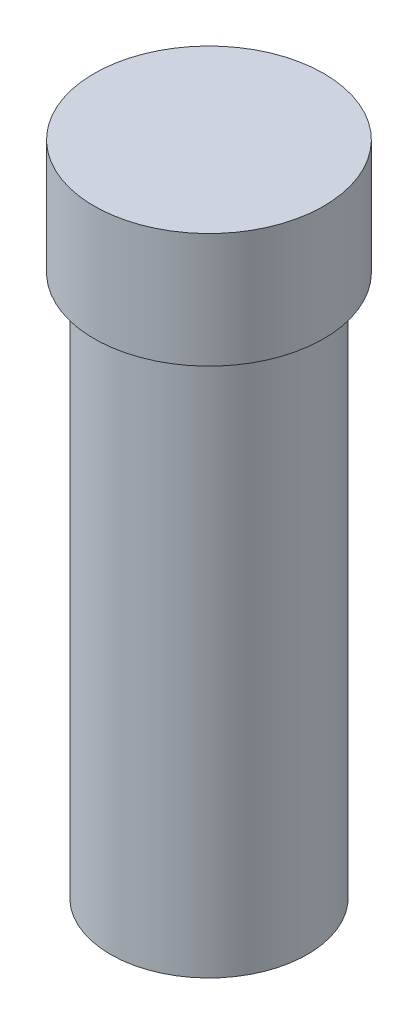
ISO-10303-21;
HEADER;
FILE_DESCRIPTION(('STEP AP214'),'2;1');
FILE_NAME('part.step','',(''),(''),'','','');
FILE_SCHEMA(('AUTOMOTIVE_DESIGN { 1 0 10303 214 1 1 1 1 }'));
ENDSEC;
DATA;
#1=APPLICATION_CONTEXT('core data for automotive mechanical design processes');
#2=APPLICATION_PROTOCOL_DEFINITION('international standard','automotive_design',2000,#1);
#3=PRODUCT_CONTEXT('',#1,'mechanical');
#4=PRODUCT('Part','Part','',(#3));
#5=PRODUCT_RELATED_PRODUCT_CATEGORY('part','',(#4));
#6=PRODUCT_DEFINITION_FORMATION('','',#4);
#7=PRODUCT_DEFINITION_CONTEXT('part definition',#1,'design');
#8=PRODUCT_DEFINITION('design','',#6,#7);
#9=PRODUCT_DEFINITION_SHAPE('','',#8);
#10=(LENGTH_UNIT() NAMED_UNIT(*) SI_UNIT(.MILLI.,.METRE.));
#11=(NAMED_UNIT(*) PLANE_ANGLE_UNIT() SI_UNIT($,.RADIAN.));
#12=(NAMED_UNIT(*) SI_UNIT($,.STERADIAN.) SOLID_ANGLE_UNIT());
#13=UNCERTAINTY_MEASURE_WITH_UNIT(LENGTH_MEASURE(1.E-05),#10,'distance_accuracy_value','');
#14=(GEOMETRIC_REPRESENTATION_CONTEXT(3) GLOBAL_UNCERTAINTY_ASSIGNED_CONTEXT((#13)) GLOBAL_UNIT_ASSIGNED_CONTEXT((#10,
#11,#12)) REPRESENTATION_CONTEXT('',''));
#15=CARTESIAN_POINT('',(0.,0.,0.));
#16=DIRECTION('',(0.,0.,1.));
#17=DIRECTION('',(1.,0.,0.));
#18=AXIS2_PLACEMENT_3D('',#15,#16,#17);
#19=CARTESIAN_POINT('',(6.,0.,0.));
#20=DIRECTION('',(0.,-1.,0.));
#21=DIRECTION('',(0.,0.,-1.));
#22=AXIS2_PLACEMENT_3D('',#19,#20,#21);
#23=PLANE('',#22);
#24=CARTESIAN_POINT('',(0.,0.,0.));
#25=DIRECTION('',(0.,-1.,0.));
#26=DIRECTION('',(0.,0.,-1.));
#27=AXIS2_PLACEMENT_3D('',#24,#25,#26);
#28=CIRCLE('',#27,6.);
#29=CARTESIAN_POINT('',(0.,0.,-6.));
#30=VERTEX_POINT('',#29);
#31=EDGE_CURVE('E60',#30,#30,#28,.T.);
#32=ORIENTED_EDGE('',*,*,#31,.T.);
#33=EDGE_LOOP('',(#32));
#34=FACE_BOUND('',#33,.T.);
#35=ADVANCED_FACE('F43',(#34),#23,.T.);
#36=CARTESIAN_POINT('',(0.,40.,0.));
#37=DIRECTION('',(0.,1.,0.));
#38=DIRECTION('',(0.,0.,1.));
#39=AXIS2_PLACEMENT_3D('',#36,#37,#38);
#40=PLANE('',#39);
#41=CARTESIAN_POINT('',(0.,40.,0.));
#42=DIRECTION('',(0.,-1.,0.));
#43=DIRECTION('',(0.,0.,-1.));
#44=AXIS2_PLACEMENT_3D('',#41,#42,#43);
#45=CIRCLE('',#44,6.99999999999999);
#46=CARTESIAN_POINT('',(0.,40.,-6.99999999999999));
#47=VERTEX_POINT('',#46);
#48=EDGE_CURVE('E10',#47,#47,#45,.T.);
#49=ORIENTED_EDGE('',*,*,#48,.F.);
#50=EDGE_LOOP('',(#49));
#51=FACE_BOUND('',#50,.T.);
#52=ADVANCED_FACE('F79',(#51),#40,.T.);
#53=CARTESIAN_POINT('',(0.,0.,0.));
#54=DIRECTION('',(0.,-1.,0.));
#55=DIRECTION('',(0.,0.,-1.));
#56=AXIS2_PLACEMENT_3D('',#53,#54,#55);
#57=CYLINDRICAL_SURFACE('',#56,7.);
#58=ORIENTED_EDGE('',*,*,#48,.T.);
#59=EDGE_LOOP('',(#58));
#60=FACE_BOUND('',#59,.T.);
#61=CARTESIAN_POINT('',(0.,33.,0.));
#62=DIRECTION('',(0.,-1.,0.));
#63=DIRECTION('',(0.,0.,-1.));
#64=AXIS2_PLACEMENT_3D('',#61,#62,#63);
#65=CIRCLE('',#64,7.);
#66=CARTESIAN_POINT('',(0.,33.,-7.));
#67=VERTEX_POINT('',#66);
#68=EDGE_CURVE('E50',#67,#67,#65,.T.);
#69=ORIENTED_EDGE('',*,*,#68,.F.);
#70=EDGE_LOOP('',(#69));
#71=FACE_BOUND('',#70,.T.);
#72=ADVANCED_FACE('F76',(#60,#71),#57,.T.);
#73=CARTESIAN_POINT('',(7.,33.,0.));
#74=DIRECTION('',(0.,-1.,0.));
#75=DIRECTION('',(0.,0.,-1.));
#76=AXIS2_PLACEMENT_3D('',#73,#74,#75);
#77=PLANE('',#76);
#78=ORIENTED_EDGE('',*,*,#68,.T.);
#79=EDGE_LOOP('',(#78));
#80=FACE_BOUND('',#79,.T.);
#81=CARTESIAN_POINT('',(0.,33.,0.));
#82=DIRECTION('',(0.,-1.,0.));
#83=DIRECTION('',(0.,0.,-1.));
#84=AXIS2_PLACEMENT_3D('',#81,#82,#83);
#85=CIRCLE('',#84,6.);
#86=CARTESIAN_POINT('',(0.,33.,-6.));
#87=VERTEX_POINT('',#86);
#88=EDGE_CURVE('E55',#87,#87,#85,.T.);
#89=ORIENTED_EDGE('',*,*,#88,.F.);
#90=EDGE_LOOP('',(#89));
#91=FACE_BOUND('',#90,.T.);
#92=ADVANCED_FACE('F70',(#80,#91),#77,.T.);
#93=CARTESIAN_POINT('',(0.,0.,0.));
#94=DIRECTION('',(0.,-1.,0.));
#95=DIRECTION('',(0.,0.,-1.));
#96=AXIS2_PLACEMENT_3D('',#93,#94,#95);
#97=CYLINDRICAL_SURFACE('',#96,6.);
#98=ORIENTED_EDGE('',*,*,#88,.T.);
#99=EDGE_LOOP('',(#98));
#100=FACE_BOUND('',#99,.T.);
#101=ORIENTED_EDGE('',*,*,#31,.F.);
#102=EDGE_LOOP('',(#101));
#103=FACE_BOUND('',#102,.T.);
#104=ADVANCED_FACE('F68',(#100,#103),#97,.T.);
#105=CLOSED_SHELL('',(#35,#52,#72,#92,#104));
#106=MANIFOLD_SOLID_BREP('B2',#105);
#107=ADVANCED_BREP_SHAPE_REPRESENTATION('',(#18,#106),#14);
#108=SHAPE_DEFINITION_REPRESENTATION(#9,#107);
ENDSEC;
END-ISO-10303-21;
